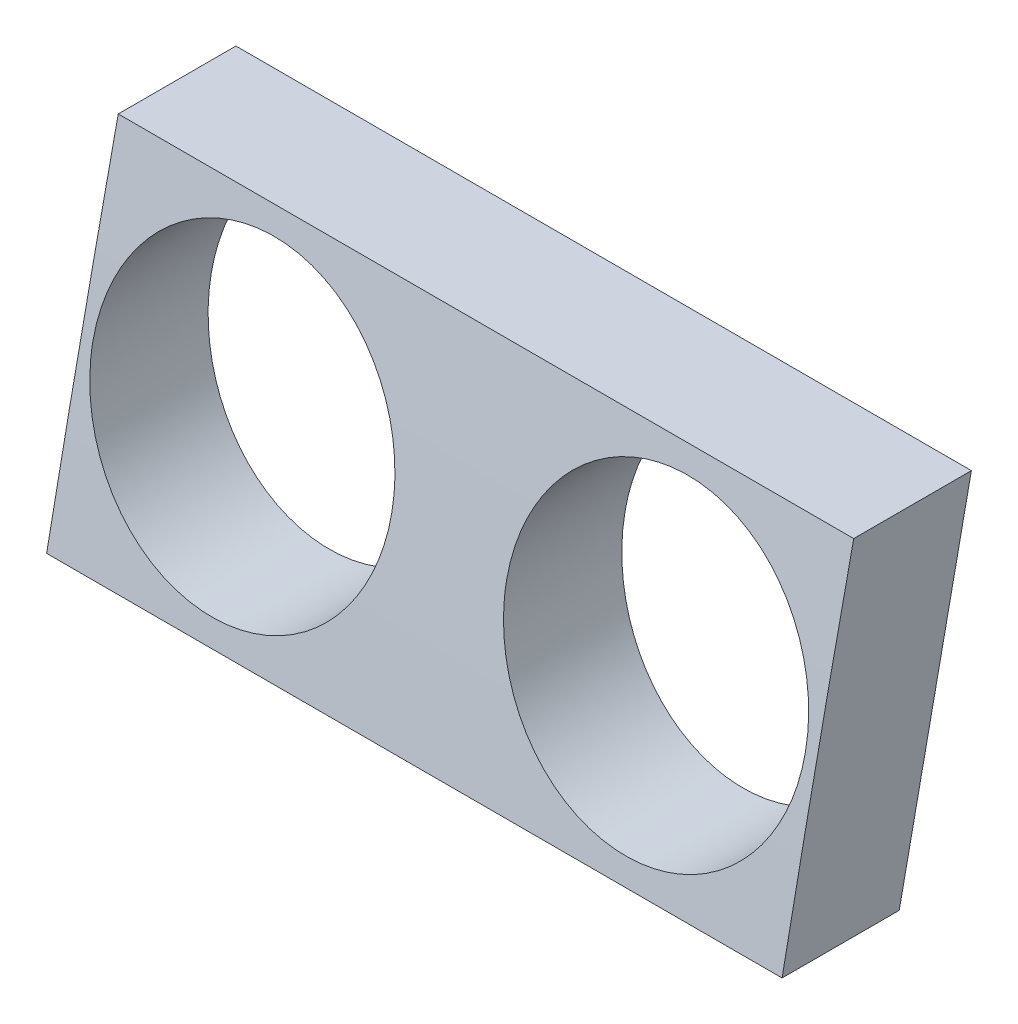
ISO-10303-21;
HEADER;
FILE_DESCRIPTION(('STEP AP214'),'2;1');
FILE_NAME('part.step','',(''),(''),'','','');
FILE_SCHEMA(('AUTOMOTIVE_DESIGN { 1 0 10303 214 1 1 1 1 }'));
ENDSEC;
DATA;
#1=APPLICATION_CONTEXT('core data for automotive mechanical design processes');
#2=APPLICATION_PROTOCOL_DEFINITION('international standard','automotive_design',2000,#1);
#3=PRODUCT_CONTEXT('',#1,'mechanical');
#4=PRODUCT('Part','Part','',(#3));
#5=PRODUCT_RELATED_PRODUCT_CATEGORY('part','',(#4));
#6=PRODUCT_DEFINITION_FORMATION('','',#4);
#7=PRODUCT_DEFINITION_CONTEXT('part definition',#1,'design');
#8=PRODUCT_DEFINITION('design','',#6,#7);
#9=PRODUCT_DEFINITION_SHAPE('','',#8);
#10=(LENGTH_UNIT() NAMED_UNIT(*) SI_UNIT(.MILLI.,.METRE.));
#11=(NAMED_UNIT(*) PLANE_ANGLE_UNIT() SI_UNIT($,.RADIAN.));
#12=(NAMED_UNIT(*) SI_UNIT($,.STERADIAN.) SOLID_ANGLE_UNIT());
#13=UNCERTAINTY_MEASURE_WITH_UNIT(LENGTH_MEASURE(1.E-05),#10,'distance_accuracy_value','');
#14=(GEOMETRIC_REPRESENTATION_CONTEXT(3) GLOBAL_UNCERTAINTY_ASSIGNED_CONTEXT((#13)) GLOBAL_UNIT_ASSIGNED_CONTEXT((#10,
#11,#12)) REPRESENTATION_CONTEXT('',''));
#15=CARTESIAN_POINT('',(0.,0.,0.));
#16=DIRECTION('',(0.,0.,1.));
#17=DIRECTION('',(1.,0.,0.));
#18=AXIS2_PLACEMENT_3D('',#15,#16,#17);
#19=CARTESIAN_POINT('',(33.9968010538605,114.317885572569,314.079701034348));
#20=DIRECTION('',(-1.,0.,0.));
#21=DIRECTION('',(0.,0.,1.));
#22=AXIS2_PLACEMENT_3D('',#19,#20,#21);
#23=PLANE('',#22);
#24=DIRECTION('',(0.,-0.978788199156415,0.204874745130144));
#25=VECTOR('',#24,1.);
#26=CARTESIAN_POINT('',(33.9968010538604,114.317885572569,-155.968991698223));
#27=LINE('',#26,#25);
#28=CARTESIAN_POINT('',(33.9968010538605,129.317885572569,-159.108711996854));
#29=VERTEX_POINT('',#28);
#30=CARTESIAN_POINT('',(33.9968010538604,114.317885572569,-155.968991698223));
#31=VERTEX_POINT('',#30);
#32=EDGE_CURVE('E63',#29,#31,#27,.T.);
#33=ORIENTED_EDGE('',*,*,#32,.T.);
#34=DIRECTION('',(0.,0.,-1.));
#35=VECTOR('',#34,1.);
#36=CARTESIAN_POINT('',(33.9968010538605,114.317885572569,314.079701034348));
#37=LINE('',#36,#35);
#38=CARTESIAN_POINT('',(33.9968010538605,114.317885572569,-150.872165521663));
#39=VERTEX_POINT('',#38);
#40=EDGE_CURVE('E99',#39,#31,#37,.T.);
#41=ORIENTED_EDGE('',*,*,#40,.F.);
#42=CARTESIAN_POINT('',(33.9968010538605,-125.065602570126,265.270668144395));
#43=CARTESIAN_POINT('',(33.9968010538605,-117.251277635846,172.226012995106));
#44=CARTESIAN_POINT('',(33.9968010538605,-135.426052024472,-37.3394253929721));
#45=CARTESIAN_POINT('',(33.9968010538605,-137.257312231371,-147.875913112743));
#46=CARTESIAN_POINT('',(33.9968010538605,-78.0900873110055,-207.114106349002));
#47=CARTESIAN_POINT('',(33.9968010538604,14.7819871578677,-96.4895904072925));
#48=CARTESIAN_POINT('',(33.9968010538604,321.817885572584,-214.72933185561));
#49=B_SPLINE_CURVE_WITH_KNOTS('',3,(#42,#43,#44,#45,#46,#47,#48),.UNSPECIFIED.,.F.,.F.,(4,1,1,1,
4),(0.,0.361871867439847,0.526261734758969,0.755385014590914,1.),.UNSPECIFIED.);
#50=CARTESIAN_POINT('',(33.9968010538605,129.317885572569,-153.988660568636));
#51=VERTEX_POINT('',#50);
#52=EDGE_CURVE('E11',#39,#51,#49,.T.);
#53=ORIENTED_EDGE('',*,*,#52,.T.);
#54=DIRECTION('',(0.,0.,-1.));
#55=VECTOR('',#54,1.);
#56=CARTESIAN_POINT('',(33.9968010538605,129.317885572569,314.079701034348));
#57=LINE('',#56,#55);
#58=EDGE_CURVE('E70',#51,#29,#57,.T.);
#59=ORIENTED_EDGE('',*,*,#58,.T.);
#60=EDGE_LOOP('',(#33,#41,#53,#59));
#61=FACE_BOUND('',#60,.T.);
#62=ADVANCED_FACE('F43',(#61),#23,.T.);
#63=CARTESIAN_POINT('',(65.9968010538605,114.317885572569,314.079701034348));
#64=DIRECTION('',(0.,-1.,0.));
#65=DIRECTION('',(0.,0.,-1.));
#66=AXIS2_PLACEMENT_3D('',#63,#64,#65);
#67=PLANE('',#66);
#68=DIRECTION('',(1.,0.,0.));
#69=VECTOR('',#68,1.);
#70=CARTESIAN_POINT('',(33.9968010538604,114.317885572569,-155.968991698223));
#71=LINE('',#70,#69);
#72=CARTESIAN_POINT('',(65.9968010538605,114.317885572569,-155.968991698223));
#73=VERTEX_POINT('',#72);
#74=EDGE_CURVE('E86',#31,#73,#71,.T.);
#75=ORIENTED_EDGE('',*,*,#74,.T.);
#76=DIRECTION('',(0.,0.,-1.));
#77=VECTOR('',#76,1.);
#78=CARTESIAN_POINT('',(65.9968010538605,114.317885572569,314.079701034348));
#79=LINE('',#78,#77);
#80=CARTESIAN_POINT('',(65.9968010538605,114.317885572569,-150.872165520551));
#81=VERTEX_POINT('',#80);
#82=EDGE_CURVE('E107',#81,#73,#79,.T.);
#83=ORIENTED_EDGE('',*,*,#82,.F.);
#84=DIRECTION('',(1.,0.,0.));
#85=VECTOR('',#84,1.);
#86=CARTESIAN_POINT('',(-0.00319894613948901,114.317885572569,-150.872165521663));
#87=LINE('',#86,#85);
#88=EDGE_CURVE('E55',#81,#39,#87,.F.);
#89=ORIENTED_EDGE('',*,*,#88,.T.);
#90=ORIENTED_EDGE('',*,*,#40,.T.);
#91=EDGE_LOOP('',(#75,#83,#89,#90));
#92=FACE_BOUND('',#91,.T.);
#93=ADVANCED_FACE('F103',(#92),#67,.T.);
#94=CARTESIAN_POINT('',(65.9968010538605,114.317885572569,314.079701034348));
#95=DIRECTION('',(1.,0.,0.));
#96=DIRECTION('',(0.,0.,-1.));
#97=AXIS2_PLACEMENT_3D('',#94,#95,#96);
#98=PLANE('',#97);
#99=DIRECTION('',(0.,-0.978788199156415,0.204874745130144));
#100=VECTOR('',#99,1.);
#101=CARTESIAN_POINT('',(65.9968010538605,114.317885572569,-155.968991698223));
#102=LINE('',#101,#100);
#103=CARTESIAN_POINT('',(65.9968010538605,129.317885572569,-159.108711996854));
#104=VERTEX_POINT('',#103);
#105=EDGE_CURVE('E89',#104,#73,#102,.T.);
#106=ORIENTED_EDGE('',*,*,#105,.F.);
#107=DIRECTION('',(0.,0.,-1.));
#108=VECTOR('',#107,1.);
#109=CARTESIAN_POINT('',(65.9968010538605,129.317885572569,314.079701034348));
#110=LINE('',#109,#108);
#111=CARTESIAN_POINT('',(65.9968010538605,129.317885572569,-153.988660568636));
#112=VERTEX_POINT('',#111);
#113=EDGE_CURVE('E113',#112,#104,#110,.T.);
#114=ORIENTED_EDGE('',*,*,#113,.F.);
#115=CARTESIAN_POINT('',(65.9968010538605,-125.065602570126,265.270668144395));
#116=CARTESIAN_POINT('',(65.9968010538605,-117.251277635846,172.226012995106));
#117=CARTESIAN_POINT('',(65.9968010538605,-135.426052024472,-37.3394253929721));
#118=CARTESIAN_POINT('',(65.9968010538605,-137.257312231371,-147.875913112743));
#119=CARTESIAN_POINT('',(65.9968010538605,-78.0900873110055,-207.114106349002));
#120=CARTESIAN_POINT('',(65.9968010538605,14.7819871578677,-96.4895904072925));
#121=CARTESIAN_POINT('',(65.9968010538605,321.817885572584,-214.72933185561));
#122=B_SPLINE_CURVE_WITH_KNOTS('',3,(#115,#116,#117,#118,#119,#120,#121),.UNSPECIFIED.,.F.,.F.,
(4,1,1,1,4),(0.,0.361871867439847,0.526261734758969,0.755385014590914,1.),.UNSPECIFIED.);
#123=EDGE_CURVE('E111',#112,#81,#122,.F.);
#124=ORIENTED_EDGE('',*,*,#123,.T.);
#125=ORIENTED_EDGE('',*,*,#82,.T.);
#126=EDGE_LOOP('',(#106,#114,#124,#125));
#127=FACE_BOUND('',#126,.T.);
#128=ADVANCED_FACE('F176',(#127),#98,.T.);
#129=CARTESIAN_POINT('',(65.9968010538605,129.317885572569,314.079701034348));
#130=DIRECTION('',(0.,1.,0.));
#131=DIRECTION('',(0.,0.,1.));
#132=AXIS2_PLACEMENT_3D('',#129,#130,#131);
#133=PLANE('',#132);
#134=DIRECTION('',(1.,0.,0.));
#135=VECTOR('',#134,1.);
#136=CARTESIAN_POINT('',(33.9968010538604,129.317885572569,-159.108711996854));
#137=LINE('',#136,#135);
#138=EDGE_CURVE('E95',#29,#104,#137,.T.);
#139=ORIENTED_EDGE('',*,*,#138,.F.);
#140=ORIENTED_EDGE('',*,*,#58,.F.);
#141=DIRECTION('',(1.,0.,0.));
#142=VECTOR('',#141,1.);
#143=CARTESIAN_POINT('',(-0.00319894613949071,129.317885572569,-153.988660568636));
#144=LINE('',#143,#142);
#145=EDGE_CURVE('E106',#51,#112,#144,.T.);
#146=ORIENTED_EDGE('',*,*,#145,.T.);
#147=ORIENTED_EDGE('',*,*,#113,.T.);
#148=EDGE_LOOP('',(#139,#140,#146,#147));
#149=FACE_BOUND('',#148,.T.);
#150=ADVANCED_FACE('F179',(#149),#133,.T.);
#151=CARTESIAN_POINT('',(-200.003198946139,-125.065602570126,265.270668144395));
#152=CARTESIAN_POINT('',(-200.003198946139,-117.251277635846,172.226012995106));
#153=CARTESIAN_POINT('',(-200.003198946139,-135.426052024472,-37.3394253929721));
#154=CARTESIAN_POINT('',(-200.003198946139,-137.257312231371,-147.875913112743));
#155=CARTESIAN_POINT('',(-200.003198946139,-78.0900873110055,-207.114106349002));
#156=CARTESIAN_POINT('',(-200.00319894614,14.7819871578677,-96.4895904072925));
#157=CARTESIAN_POINT('',(-200.00319894614,321.817885572583,-214.72933185561));
#158=B_SPLINE_CURVE_WITH_KNOTS('',3,(#151,#152,#153,#154,#155,#156,#157),.UNSPECIFIED.,.F.,.F.,
(4,1,1,1,4),(0.,0.361871867439847,0.526261734758969,0.755385014590914,1.),.UNSPECIFIED.);
#159=DIRECTION('',(1.,0.,0.));
#160=VECTOR('',#159,1.);
#161=SURFACE_OF_LINEAR_EXTRUSION('',#158,#160);
#162=CARTESIAN_POINT('',(52.4968010538605,121.817885572569,-152.387851020532));
#163=CARTESIAN_POINT('',(52.4967999051049,122.003673449547,-152.426471125802));
#164=CARTESIAN_POINT('',(52.5047692796665,122.189424935316,-152.465162219448));
#165=CARTESIAN_POINT('',(52.5365914936259,122.559649588583,-152.542432745769));
#166=CARTESIAN_POINT('',(52.5604485726214,122.74412240159,-152.581012145879));
#167=CARTESIAN_POINT('',(52.6239271615071,123.110594381692,-152.657803938396));
#168=CARTESIAN_POINT('',(52.6635632686161,123.29259109646,-152.696015957321));
#169=CARTESIAN_POINT('',(52.7583644222967,123.65271209437,-152.771770987836));
#170=CARTESIAN_POINT('',(52.8135351059352,123.830834946471,-152.809313751304));
#171=CARTESIAN_POINT('',(52.939021259906,124.181784282804,-152.883418752228));
#172=CARTESIAN_POINT('',(53.0093301406705,124.354613034255,-152.919981408556));
#173=CARTESIAN_POINT('',(53.164685523062,124.693863192213,-152.991877029457));
#174=CARTESIAN_POINT('',(53.2497374661033,124.86028220518,-153.0272095342));
#175=CARTESIAN_POINT('',(53.4339497051151,125.185311413611,-153.096331229337));
#176=CARTESIAN_POINT('',(53.5331008743431,125.343926571973,-153.130121399571));
#177=CARTESIAN_POINT('',(53.7449385719755,125.652328039188,-153.195923119203));
#178=CARTESIAN_POINT('',(53.8576300171762,125.802111111289,-153.227934016295));
#179=CARTESIAN_POINT('',(54.094653786049,126.09028947536,-153.289610916369));
#180=CARTESIAN_POINT('',(54.2188682504744,126.228777626495,-153.319295939439));
#181=CARTESIAN_POINT('',(54.4789708822384,126.494831034383,-153.376399308368));
#182=CARTESIAN_POINT('',(54.6148589881385,126.622396348618,-153.403817666154));
#183=CARTESIAN_POINT('',(54.897363433526,126.865592750931,-153.45615097803));
#184=CARTESIAN_POINT('',(55.0439792489731,126.981224421294,-153.481066054261));
#185=CARTESIAN_POINT('',(55.3469108931194,127.199629500555,-153.528174761057));
#186=CARTESIAN_POINT('',(55.5032267829302,127.302402828432,-153.550368374472));
#187=CARTESIAN_POINT('',(55.8210143175074,127.492205149208,-153.591392567697));
#188=CARTESIAN_POINT('',(55.9823062074768,127.579521922996,-153.61028450984));
#189=CARTESIAN_POINT('',(56.3120125649677,127.740348223233,-153.645106796645));
#190=CARTESIAN_POINT('',(56.4804294675904,127.813852981703,-153.661036118577));
#191=CARTESIAN_POINT('',(56.8230345217487,127.946381221148,-153.689773532487));
#192=CARTESIAN_POINT('',(56.9972199115034,128.005411521472,-153.702583094257));
#193=CARTESIAN_POINT('',(57.350224988919,128.108562123355,-153.724976635224));
#194=CARTESIAN_POINT('',(57.5290463390387,128.152676994322,-153.734559439577));
#195=CARTESIAN_POINT('',(57.8861968481142,128.224839701975,-153.750239421178));
#196=CARTESIAN_POINT('',(58.0644598057095,128.253200741991,-153.75640454033));
#197=CARTESIAN_POINT('',(58.4228104596834,128.295004890137,-153.765493140324));
#198=CARTESIAN_POINT('',(58.6028981611979,128.308447956266,-153.76841661204));
#199=CARTESIAN_POINT('',(58.963575260386,128.320304412812,-153.770995002166));
#200=CARTESIAN_POINT('',(59.1441646136922,128.318719092566,-153.770650200973));
#201=CARTESIAN_POINT('',(59.504553991864,128.300534727659,-153.766695823091));
#202=CARTESIAN_POINT('',(59.6843540002552,128.283935371125,-153.763086178584));
#203=CARTESIAN_POINT('',(60.0400804681212,128.23609836584,-153.752686961712));
#204=CARTESIAN_POINT('',(60.2160276642156,128.205007783545,-153.745929337479));
#205=CARTESIAN_POINT('',(60.5646865734865,128.128479927136,-153.729303342942));
#206=CARTESIAN_POINT('',(60.7373971605226,128.083037754249,-153.719433910455));
#207=CARTESIAN_POINT('',(61.0782534435946,127.978188927657,-153.696675687456));
#208=CARTESIAN_POINT('',(61.2464007480232,127.91878726739,-153.683787976615));
#209=CARTESIAN_POINT('',(61.5770951540629,127.786454700602,-153.655098255186));
#210=CARTESIAN_POINT('',(61.739640148945,127.713518768986,-153.639295162168));
#211=CARTESIAN_POINT('',(62.0588051352741,127.554268383453,-153.60482005702));
#212=CARTESIAN_POINT('',(62.2153897333147,127.467886021787,-153.586133487043));
#213=CARTESIAN_POINT('',(62.5206942366196,127.282692291112,-153.546111577946));
#214=CARTESIAN_POINT('',(62.6694112374765,127.183876376981,-153.524775270243));
#215=CARTESIAN_POINT('',(63.1021459521383,126.869900793694,-153.457057734582));
#216=CARTESIAN_POINT('',(63.3730609283547,126.637056171298,-153.406933823186));
#217=CARTESIAN_POINT('',(63.8767580669649,126.126830661157,-153.297406966526));
#218=CARTESIAN_POINT('',(64.1087692865056,125.848725998593,-153.237853742498));
#219=CARTESIAN_POINT('',(64.5230054232472,125.258944749711,-153.111967525121));
#220=CARTESIAN_POINT('',(64.7052247234899,124.947264381288,-153.04563376803));
#221=CARTESIAN_POINT('',(65.0187604720515,124.291914135414,-152.90665274245));
#222=CARTESIAN_POINT('',(65.1488836922041,123.947695964896,-152.833899541511));
#223=CARTESIAN_POINT('',(65.3492628563535,123.242842167208,-152.685497481452));
#224=CARTESIAN_POINT('',(65.4195129894471,122.882204950088,-152.609848342014));
#225=CARTESIAN_POINT('',(65.4990170969021,122.148653792538,-152.456588397014));
#226=CARTESIAN_POINT('',(65.5072921810556,121.775635943112,-152.378965466097));
#227=CARTESIAN_POINT('',(65.4599928277138,121.033363175079,-152.225132393776));
#228=CARTESIAN_POINT('',(65.404415925404,120.66410840229,-152.148922307027));
#229=CARTESIAN_POINT('',(65.2304389847472,119.938722151862,-151.999807452407));
#230=CARTESIAN_POINT('',(65.1118463843297,119.582634496839,-151.926913563354));
#231=CARTESIAN_POINT('',(64.8147438431926,118.895250014476,-151.786732821583));
#232=CARTESIAN_POINT('',(64.6362362858795,118.563952201641,-151.71944574596));
#233=CARTESIAN_POINT('',(64.2259416021186,117.939212151061,-151.592996883485));
#234=CARTESIAN_POINT('',(63.9947245309101,117.64541387533,-151.533758268182));
#235=CARTESIAN_POINT('',(63.6122800801544,117.237245633697,-151.451701579717));
#236=CARTESIAN_POINT('',(63.4787974862787,117.106562220547,-151.425473141062));
#237=CARTESIAN_POINT('',(63.200864097145,116.856961472092,-151.375447703788));
#238=CARTESIAN_POINT('',(63.0564137286987,116.738043679342,-151.351650610638));
#239=CARTESIAN_POINT('',(62.6135259677715,116.404594453302,-151.285006551329));
#240=CARTESIAN_POINT('',(62.3005268213514,116.20801948273,-151.245833404403));
#241=CARTESIAN_POINT('',(61.8093051829085,115.954951086987,-151.195488493267));
#242=CARTESIAN_POINT('',(61.6418535508331,115.877531938512,-151.180103650323));
#243=CARTESIAN_POINT('',(61.3007743711352,115.737126797321,-151.152223223532));
#244=CARTESIAN_POINT('',(61.1271492888399,115.674135116238,-151.139726500959));
#245=CARTESIAN_POINT('',(60.7782016559149,115.564126956078,-151.117914930208));
#246=CARTESIAN_POINT('',(60.6029667196593,115.516841947308,-151.108546581118));
#247=CARTESIAN_POINT('',(60.2490898511633,115.437082404338,-151.092750397077));
#248=CARTESIAN_POINT('',(60.0704492010533,115.404602406964,-151.086321477449));
#249=CARTESIAN_POINT('',(59.7109739582594,115.354690341937,-151.076444225016));
#250=CARTESIAN_POINT('',(59.5301390857745,115.337260214293,-151.072996276473));
#251=CARTESIAN_POINT('',(59.1676167337733,115.317595418055,-151.069106380324));
#252=CARTESIAN_POINT('',(58.9859292779943,115.315360328889,-151.068664349519));
#253=CARTESIAN_POINT('',(58.6250035378079,115.326044032542,-151.070777582262));
#254=CARTESIAN_POINT('',(58.4457601531701,115.338797819226,-151.073300209154));
#255=CARTESIAN_POINT('',(58.0890108764384,115.37908604178,-151.081271644066));
#256=CARTESIAN_POINT('',(57.911504955467,115.406620231566,-151.086720403369));
#257=CARTESIAN_POINT('',(57.5594579244126,115.476257464352,-151.100507962368));
#258=CARTESIAN_POINT('',(57.3849173219339,115.518362975832,-151.108847251741));
#259=CARTESIAN_POINT('',(57.040123844986,115.616793271799,-151.128355286839));
#260=CARTESIAN_POINT('',(56.8698694525541,115.673112942159,-151.139523014924));
#261=CARTESIAN_POINT('',(56.534610769283,115.79960100728,-151.16462568671));
#262=CARTESIAN_POINT('',(56.3696116328765,115.869782539997,-151.178563255681));
#263=CARTESIAN_POINT('',(56.0462295620499,116.02339165202,-151.20909945881));
#264=CARTESIAN_POINT('',(55.8878442940141,116.106814508559,-151.225697144207));
#265=CARTESIAN_POINT('',(55.5786501774763,116.286320561844,-151.261452327928));
#266=CARTESIAN_POINT('',(55.42784393868,116.382408078741,-151.280610699782));
#267=CARTESIAN_POINT('',(55.1349246966177,116.586465021118,-151.321348713367));
#268=CARTESIAN_POINT('',(54.9928087094179,116.694430332123,-151.342927516709));
#269=CARTESIAN_POINT('',(54.7165070690814,116.922827724446,-151.388641087644));
#270=CARTESIAN_POINT('',(54.5824360028384,117.043392950851,-151.412803231841));
#271=CARTESIAN_POINT('',(54.3250163261946,117.294965532562,-151.463297874771));
#272=CARTESIAN_POINT('',(54.2016640628077,117.425969300987,-151.489629628091));
#273=CARTESIAN_POINT('',(53.966345134801,117.697591556655,-151.544315352813));
#274=CARTESIAN_POINT('',(53.8543860144019,117.838216312919,-151.572670643277));
#275=CARTESIAN_POINT('',(53.6426872910931,118.127947077779,-151.631192541317));
#276=CARTESIAN_POINT('',(53.5429435499449,118.277050188932,-151.661358530288));
#277=CARTESIAN_POINT('',(53.3544453752247,118.585681398498,-151.723912414706));
#278=CARTESIAN_POINT('',(53.265939504799,118.745354944112,-151.756331907594));
#279=CARTESIAN_POINT('',(53.1027945856014,119.071271626243,-151.82263075912));
#280=CARTESIAN_POINT('',(53.0281508955102,119.237512541191,-151.856509624435));
#281=CARTESIAN_POINT('',(52.8932016309381,119.575314474734,-151.92548589504));
#282=CARTESIAN_POINT('',(52.832884739436,119.746871172367,-151.960582313275));
#283=CARTESIAN_POINT('',(52.7268872315548,120.094184156171,-152.031775100643));
#284=CARTESIAN_POINT('',(52.6812030510027,120.26993940845,-152.067871223943));
#285=CARTESIAN_POINT('',(52.5943893089045,120.672392465278,-152.150691412589));
#286=CARTESIAN_POINT('',(52.5578160560971,120.90003793882,-152.197654771695));
#287=CARTESIAN_POINT('',(52.509022509041,121.357769377254,-152.292326147593));
#288=CARTESIAN_POINT('',(52.4968024761733,121.587855368313,-152.34003417237));
#289=CARTESIAN_POINT('',(52.4968010538605,121.817885572569,-152.387851020532));
#290=B_SPLINE_CURVE_WITH_KNOTS('',3,(#162,#163,#164,#165,#166,#167,#168,#169,#170,#171,#172,
#173,#174,#175,#176,#177,#178,#179,#180,#181,#182,#183,#184,#185,#186,#187,#188,#189,#190,#191,
#192,#193,#194,#195,#196,#197,#198,#199,#200,#201,#202,#203,#204,#205,#206,#207,#208,#209,#210,
#211,#212,#213,#214,#215,#216,#217,#218,#219,#220,#221,#222,#223,#224,#225,#226,#227,#228,#229,
#230,#231,#232,#233,#234,#235,#236,#237,#238,#239,#240,#241,#242,#243,#244,#245,#246,#247,#248,
#249,#250,#251,#252,#253,#254,#255,#256,#257,#258,#259,#260,#261,#262,#263,#264,#265,#266,#267,
#268,#269,#270,#271,#272,#273,#274,#275,#276,#277,#278,#279,#280,#281,#282,#283,#284,#285,#286,
#287,#288,#289),.UNSPECIFIED.,.T.,.F.,(4,2,2,2,2,2,2,2,2,2,2,2,2,2,2,2,2,2,2,2,2,2,2,2,2,2,2,2,
2,2,2,2,2,2,2,2,2,2,2,2,2,2,2,2,2,2,2,2,2,2,2,2,2,2,2,2,2,2,2,2,2,2,2,4),(0.,0.569074781778865,
1.13830148074252,1.70805600104299,2.27801753649183,2.84773147083728,3.4176561264015,
3.98721352243881,4.55697836693515,5.12145052115293,5.68591970472594,6.25036133279942,
6.81480651727025,7.36727597297288,7.91993579501277,8.47233474009721,9.02493459333079,
9.56611431187093,10.1072955540539,10.6484303668239,11.1895764203484,11.7253463108784,
12.2612992791573,12.7970608231159,13.33302168765,13.8717827848509,14.4107414031414,
15.4876144896571,16.5837987559694,17.680106630322,18.8002571513961,19.9205163748223,
21.0584334035349,22.1963943595958,23.3378528416336,24.4792659220324,25.6088756040769,
26.17416356903,26.7394295470258,27.8479930464156,28.4028388387243,28.957465492114,
29.5020527858426,30.0464389592005,30.5908952963531,31.1353365638332,31.6738400200339,
32.21233451086,32.7509202710188,33.2893125283775,33.8282175316063,34.3669307543889,
34.9058282202349,35.4445395959726,35.9896659640359,36.5346058174633,37.0799041983573,
37.6250173329511,38.1806260157795,38.7360483336278,39.2910304423771,39.8458772679819,
40.5504602873697,41.2550508689471),.UNSPECIFIED.);
#291=CARTESIAN_POINT('',(52.4968010538605,121.817885572569,-152.387851020532));
#292=VERTEX_POINT('',#291);
#293=EDGE_CURVE('E154',#292,#292,#290,.T.);
#294=ORIENTED_EDGE('',*,*,#293,.T.);
#295=EDGE_LOOP('',(#294));
#296=FACE_BOUND('',#295,.T.);
#297=CARTESIAN_POINT('',(34.4968010538605,121.817885572569,-152.387851020532));
#298=CARTESIAN_POINT('',(34.4967999051049,122.003673449547,-152.426471125802));
#299=CARTESIAN_POINT('',(34.5047692796665,122.189424935316,-152.465162219448));
#300=CARTESIAN_POINT('',(34.5365914936259,122.559649588583,-152.542432745769));
#301=CARTESIAN_POINT('',(34.5604485726214,122.74412240159,-152.581012145879));
#302=CARTESIAN_POINT('',(34.6239271615071,123.110594381692,-152.657803938396));
#303=CARTESIAN_POINT('',(34.6635632686161,123.29259109646,-152.696015957321));
#304=CARTESIAN_POINT('',(34.7583644222967,123.65271209437,-152.771770987836));
#305=CARTESIAN_POINT('',(34.8135351059352,123.830834946471,-152.809313751304));
#306=CARTESIAN_POINT('',(34.939021259906,124.181784282804,-152.883418752228));
#307=CARTESIAN_POINT('',(35.0093301406705,124.354613034255,-152.919981408556));
#308=CARTESIAN_POINT('',(35.164685523062,124.693863192213,-152.991877029457));
#309=CARTESIAN_POINT('',(35.2497374661033,124.86028220518,-153.0272095342));
#310=CARTESIAN_POINT('',(35.4339497051151,125.185311413611,-153.096331229337));
#311=CARTESIAN_POINT('',(35.5331008743431,125.343926571973,-153.130121399571));
#312=CARTESIAN_POINT('',(35.7449385719755,125.652328039188,-153.195923119203));
#313=CARTESIAN_POINT('',(35.8576300171762,125.802111111289,-153.227934016295));
#314=CARTESIAN_POINT('',(36.094653786049,126.09028947536,-153.289610916369));
#315=CARTESIAN_POINT('',(36.2188682504744,126.228777626495,-153.319295939439));
#316=CARTESIAN_POINT('',(36.4789708822384,126.494831034383,-153.376399308368));
#317=CARTESIAN_POINT('',(36.6148589881385,126.622396348618,-153.403817666154));
#318=CARTESIAN_POINT('',(36.897363433526,126.865592750931,-153.45615097803));
#319=CARTESIAN_POINT('',(37.0439792489731,126.981224421294,-153.481066054261));
#320=CARTESIAN_POINT('',(37.3469108931194,127.199629500555,-153.528174761057));
#321=CARTESIAN_POINT('',(37.5032267829301,127.302402828432,-153.550368374472));
#322=CARTESIAN_POINT('',(37.8210143175074,127.492205149208,-153.591392567697));
#323=CARTESIAN_POINT('',(37.9823062074767,127.579521922996,-153.61028450984));
#324=CARTESIAN_POINT('',(38.3120125649677,127.740348223233,-153.645106796645));
#325=CARTESIAN_POINT('',(38.4804294675904,127.813852981703,-153.661036118577));
#326=CARTESIAN_POINT('',(38.8230345217487,127.946381221148,-153.689773532487));
#327=CARTESIAN_POINT('',(38.9972199115034,128.005411521472,-153.702583094257));
#328=CARTESIAN_POINT('',(39.350224988919,128.108562123355,-153.724976635224));
#329=CARTESIAN_POINT('',(39.5290463390387,128.152676994322,-153.734559439577));
#330=CARTESIAN_POINT('',(39.8861968481142,128.224839701975,-153.750239421178));
#331=CARTESIAN_POINT('',(40.0644598057096,128.253200741991,-153.75640454033));
#332=CARTESIAN_POINT('',(40.4228104596834,128.295004890137,-153.765493140324));
#333=CARTESIAN_POINT('',(40.6028981611979,128.308447956266,-153.76841661204));
#334=CARTESIAN_POINT('',(40.963575260386,128.320304412812,-153.770995002166));
#335=CARTESIAN_POINT('',(41.1441646136923,128.318719092566,-153.770650200973));
#336=CARTESIAN_POINT('',(41.504553991864,128.300534727659,-153.766695823091));
#337=CARTESIAN_POINT('',(41.6843540002552,128.283935371125,-153.763086178584));
#338=CARTESIAN_POINT('',(42.0400804681212,128.23609836584,-153.752686961712));
#339=CARTESIAN_POINT('',(42.2160276642156,128.205007783545,-153.745929337479));
#340=CARTESIAN_POINT('',(42.5646865734865,128.128479927136,-153.729303342942));
#341=CARTESIAN_POINT('',(42.7373971605226,128.083037754249,-153.719433910455));
#342=CARTESIAN_POINT('',(43.0782534435946,127.978188927657,-153.696675687456));
#343=CARTESIAN_POINT('',(43.2464007480232,127.91878726739,-153.683787976615));
#344=CARTESIAN_POINT('',(43.5770951540629,127.786454700602,-153.655098255186));
#345=CARTESIAN_POINT('',(43.739640148945,127.713518768986,-153.639295162168));
#346=CARTESIAN_POINT('',(44.0588051352741,127.554268383453,-153.60482005702));
#347=CARTESIAN_POINT('',(44.2153897333147,127.467886021787,-153.586133487043));
#348=CARTESIAN_POINT('',(44.5206942366196,127.282692291113,-153.546111577946));
#349=CARTESIAN_POINT('',(44.6694112374765,127.183876376981,-153.524775270243));
#350=CARTESIAN_POINT('',(45.1021459521383,126.869900793694,-153.457057734582));
#351=CARTESIAN_POINT('',(45.3730609283546,126.637056171298,-153.406933823186));
#352=CARTESIAN_POINT('',(45.8767580669648,126.126830661157,-153.297406966526));
#353=CARTESIAN_POINT('',(46.1087692865055,125.848725998594,-153.237853742498));
#354=CARTESIAN_POINT('',(46.5230054232471,125.258944749711,-153.111967525121));
#355=CARTESIAN_POINT('',(46.7052247234899,124.947264381288,-153.04563376803));
#356=CARTESIAN_POINT('',(47.0187604720515,124.291914135414,-152.90665274245));
#357=CARTESIAN_POINT('',(47.1488836922041,123.947695964896,-152.833899541511));
#358=CARTESIAN_POINT('',(47.3492628563535,123.242842167208,-152.685497481452));
#359=CARTESIAN_POINT('',(47.4195129894471,122.882204950088,-152.609848342014));
#360=CARTESIAN_POINT('',(47.4990170969021,122.148653792538,-152.456588397014));
#361=CARTESIAN_POINT('',(47.5072921810556,121.775635943112,-152.378965466097));
#362=CARTESIAN_POINT('',(47.4599928277138,121.033363175079,-152.225132393776));
#363=CARTESIAN_POINT('',(47.404415925404,120.66410840229,-152.148922307027));
#364=CARTESIAN_POINT('',(47.2304389847472,119.938722151862,-151.999807452407));
#365=CARTESIAN_POINT('',(47.1118463843297,119.582634496839,-151.926913563354));
#366=CARTESIAN_POINT('',(46.8147438431926,118.895250014476,-151.786732821583));
#367=CARTESIAN_POINT('',(46.6362362858795,118.563952201641,-151.71944574596));
#368=CARTESIAN_POINT('',(46.2259416021186,117.939212151061,-151.592996883485));
#369=CARTESIAN_POINT('',(45.9947245309101,117.64541387533,-151.533758268182));
#370=CARTESIAN_POINT('',(45.6122800801544,117.237245633697,-151.451701579717));
#371=CARTESIAN_POINT('',(45.4787974862787,117.106562220547,-151.425473141062));
#372=CARTESIAN_POINT('',(45.200864097145,116.856961472092,-151.375447703788));
#373=CARTESIAN_POINT('',(45.0564137286987,116.738043679342,-151.351650610638));
#374=CARTESIAN_POINT('',(44.6135259677715,116.404594453301,-151.285006551329));
#375=CARTESIAN_POINT('',(44.3005268213514,116.20801948273,-151.245833404403));
#376=CARTESIAN_POINT('',(43.8093051829085,115.954951086987,-151.195488493268));
#377=CARTESIAN_POINT('',(43.6418535508331,115.877531938512,-151.180103650323));
#378=CARTESIAN_POINT('',(43.3007743711352,115.737126797321,-151.152223223532));
#379=CARTESIAN_POINT('',(43.1271492888399,115.674135116238,-151.139726500959));
#380=CARTESIAN_POINT('',(42.7782016559149,115.564126956078,-151.117914930208));
#381=CARTESIAN_POINT('',(42.6029667196593,115.516841947308,-151.108546581118));
#382=CARTESIAN_POINT('',(42.2490898511633,115.437082404338,-151.092750397077));
#383=CARTESIAN_POINT('',(42.0704492010533,115.404602406964,-151.086321477449));
#384=CARTESIAN_POINT('',(41.7109739582595,115.354690341937,-151.076444225016));
#385=CARTESIAN_POINT('',(41.5301390857746,115.337260214293,-151.072996276473));
#386=CARTESIAN_POINT('',(41.1676167337734,115.317595418055,-151.069106380324));
#387=CARTESIAN_POINT('',(40.9859292779944,115.315360328889,-151.068664349519));
#388=CARTESIAN_POINT('',(40.6250035378079,115.326044032542,-151.070777582262));
#389=CARTESIAN_POINT('',(40.4457601531702,115.338797819226,-151.073300209154));
#390=CARTESIAN_POINT('',(40.0890108764384,115.37908604178,-151.081271644066));
#391=CARTESIAN_POINT('',(39.9115049554671,115.406620231566,-151.086720403369));
#392=CARTESIAN_POINT('',(39.5594579244126,115.476257464352,-151.100507962368));
#393=CARTESIAN_POINT('',(39.3849173219339,115.518362975832,-151.108847251741));
#394=CARTESIAN_POINT('',(39.040123844986,115.616793271799,-151.128355286839));
#395=CARTESIAN_POINT('',(38.8698694525542,115.673112942159,-151.139523014924));
#396=CARTESIAN_POINT('',(38.534610769283,115.79960100728,-151.16462568671));
#397=CARTESIAN_POINT('',(38.3696116328765,115.869782539997,-151.178563255681));
#398=CARTESIAN_POINT('',(38.0462295620499,116.02339165202,-151.20909945881));
#399=CARTESIAN_POINT('',(37.8878442940141,116.106814508559,-151.225697144207));
#400=CARTESIAN_POINT('',(37.5786501774764,116.286320561844,-151.261452327928));
#401=CARTESIAN_POINT('',(37.4278439386801,116.382408078741,-151.280610699782));
#402=CARTESIAN_POINT('',(37.1349246966177,116.586465021118,-151.321348713367));
#403=CARTESIAN_POINT('',(36.9928087094179,116.694430332123,-151.342927516709));
#404=CARTESIAN_POINT('',(36.7165070690815,116.922827724446,-151.388641087644));
#405=CARTESIAN_POINT('',(36.5824360028384,117.043392950851,-151.412803231841));
#406=CARTESIAN_POINT('',(36.3250163261947,117.294965532562,-151.463297874771));
#407=CARTESIAN_POINT('',(36.2016640628078,117.425969300987,-151.489629628091));
#408=CARTESIAN_POINT('',(35.966345134801,117.697591556655,-151.544315352813));
#409=CARTESIAN_POINT('',(35.8543860144019,117.838216312919,-151.572670643277));
#410=CARTESIAN_POINT('',(35.6426872910931,118.127947077779,-151.631192541317));
#411=CARTESIAN_POINT('',(35.5429435499449,118.277050188932,-151.661358530288));
#412=CARTESIAN_POINT('',(35.3544453752247,118.585681398498,-151.723912414707));
#413=CARTESIAN_POINT('',(35.265939504799,118.745354944112,-151.756331907594));
#414=CARTESIAN_POINT('',(35.1027945856014,119.071271626243,-151.82263075912));
#415=CARTESIAN_POINT('',(35.0281508955102,119.237512541191,-151.856509624435));
#416=CARTESIAN_POINT('',(34.8932016309381,119.575314474734,-151.92548589504));
#417=CARTESIAN_POINT('',(34.832884739436,119.746871172367,-151.960582313275));
#418=CARTESIAN_POINT('',(34.7268872315548,120.094184156171,-152.031775100643));
#419=CARTESIAN_POINT('',(34.6812030510027,120.26993940845,-152.067871223943));
#420=CARTESIAN_POINT('',(34.5943893089045,120.672392465278,-152.150691412589));
#421=CARTESIAN_POINT('',(34.5578160560971,120.90003793882,-152.197654771695));
#422=CARTESIAN_POINT('',(34.509022509041,121.357769377254,-152.292326147593));
#423=CARTESIAN_POINT('',(34.4968024761733,121.587855368313,-152.34003417237));
#424=CARTESIAN_POINT('',(34.4968010538605,121.817885572569,-152.387851020532));
#425=B_SPLINE_CURVE_WITH_KNOTS('',3,(#297,#298,#299,#300,#301,#302,#303,#304,#305,#306,#307,
#308,#309,#310,#311,#312,#313,#314,#315,#316,#317,#318,#319,#320,#321,#322,#323,#324,#325,#326,
#327,#328,#329,#330,#331,#332,#333,#334,#335,#336,#337,#338,#339,#340,#341,#342,#343,#344,#345,
#346,#347,#348,#349,#350,#351,#352,#353,#354,#355,#356,#357,#358,#359,#360,#361,#362,#363,#364,
#365,#366,#367,#368,#369,#370,#371,#372,#373,#374,#375,#376,#377,#378,#379,#380,#381,#382,#383,
#384,#385,#386,#387,#388,#389,#390,#391,#392,#393,#394,#395,#396,#397,#398,#399,#400,#401,#402,
#403,#404,#405,#406,#407,#408,#409,#410,#411,#412,#413,#414,#415,#416,#417,#418,#419,#420,#421,
#422,#423,#424),.UNSPECIFIED.,.T.,.F.,(4,2,2,2,2,2,2,2,2,2,2,2,2,2,2,2,2,2,2,2,2,2,2,2,2,2,2,2,
2,2,2,2,2,2,2,2,2,2,2,2,2,2,2,2,2,2,2,2,2,2,2,2,2,2,2,2,2,2,2,2,2,2,2,4),(0.,0.569074781778865,
1.13830148074252,1.70805600104299,2.27801753649182,2.84773147083729,3.41765612640151,
3.98721352243882,4.55697836693518,5.12145052115297,5.68591970472596,6.25036133279942,
6.81480651727026,7.36727597297289,7.91993579501279,8.47233474009724,9.02493459333082,
9.56611431187097,10.1072955540539,10.6484303668239,11.1895764203484,11.7253463108784,
12.2612992791573,12.7970608231159,13.3330216876501,13.8717827848509,14.4107414031414,
15.4876144896571,16.5837987559693,17.6801066303218,18.800257151396,19.9205163748223,
21.0584334035349,22.1963943595959,23.3378528416336,24.4792659220324,25.608875604077,
26.1741635690301,26.7394295470258,27.8479930464156,28.4028388387243,28.957465492114,
29.5020527858426,30.0464389592005,30.5908952963531,31.1353365638332,31.6738400200339,
32.2123345108601,32.7509202710188,33.2893125283775,33.8282175316063,34.3669307543889,
34.9058282202349,35.4445395959726,35.9896659640359,36.5346058174633,37.0799041983573,
37.6250173329512,38.1806260157796,38.7360483336279,39.2910304423772,39.845877267982,
40.5504602873698,41.2550508689471),.UNSPECIFIED.);
#426=CARTESIAN_POINT('',(34.4968010538605,121.817885572569,-152.387851020532));
#427=VERTEX_POINT('',#426);
#428=EDGE_CURVE('E144',#427,#427,#425,.T.);
#429=ORIENTED_EDGE('',*,*,#428,.T.);
#430=EDGE_LOOP('',(#429));
#431=FACE_BOUND('',#430,.T.);
#432=ORIENTED_EDGE('',*,*,#52,.F.);
#433=ORIENTED_EDGE('',*,*,#88,.F.);
#434=ORIENTED_EDGE('',*,*,#123,.F.);
#435=ORIENTED_EDGE('',*,*,#145,.F.);
#436=EDGE_LOOP('',(#432,#433,#434,#435));
#437=FACE_BOUND('',#436,.T.);
#438=ADVANCED_FACE('F45',(#296,#431,#437),#161,.F.);
#439=CARTESIAN_POINT('',(33.9968010538604,114.317885572569,-155.968991698223));
#440=DIRECTION('',(0.,0.204874745130144,0.978788199156415));
#441=DIRECTION('',(0.,-0.978788199156415,0.204874745130144));
#442=AXIS2_PLACEMENT_3D('',#439,#440,#441);
#443=PLANE('',#442);
#444=CARTESIAN_POINT('',(58.9968010538605,121.817885572569,-157.538851847539));
#445=DIRECTION('',(0.,0.204874745130144,0.978788199156415));
#446=DIRECTION('',(0.,0.978788199156415,-0.204874745130144));
#447=AXIS2_PLACEMENT_3D('',#444,#445,#446);
#448=ELLIPSE('',#447,6.64086469943358,6.5);
#449=CARTESIAN_POINT('',(58.9968010538602,128.317885572569,-158.899397310279));
#450=VERTEX_POINT('',#449);
#451=EDGE_CURVE('E49',#450,#450,#448,.T.);
#452=ORIENTED_EDGE('',*,*,#451,.T.);
#453=EDGE_LOOP('',(#452));
#454=FACE_BOUND('',#453,.T.);
#455=CARTESIAN_POINT('',(40.9968010538605,121.817885572569,-157.538851847539));
#456=DIRECTION('',(0.,0.204874745130144,0.978788199156415));
#457=DIRECTION('',(0.,0.978788199156415,-0.204874745130144));
#458=AXIS2_PLACEMENT_3D('',#455,#456,#457);
#459=ELLIPSE('',#458,6.64086469943359,6.50000000000001);
#460=CARTESIAN_POINT('',(40.9968010538602,128.317885572569,-158.899397310279));
#461=VERTEX_POINT('',#460);
#462=EDGE_CURVE('E138',#461,#461,#459,.T.);
#463=ORIENTED_EDGE('',*,*,#462,.T.);
#464=EDGE_LOOP('',(#463));
#465=FACE_BOUND('',#464,.T.);
#466=ORIENTED_EDGE('',*,*,#105,.T.);
#467=ORIENTED_EDGE('',*,*,#74,.F.);
#468=ORIENTED_EDGE('',*,*,#32,.F.);
#469=ORIENTED_EDGE('',*,*,#138,.T.);
#470=EDGE_LOOP('',(#466,#467,#468,#469));
#471=FACE_BOUND('',#470,.T.);
#472=ADVANCED_FACE('F87',(#454,#465,#471),#443,.F.);
#473=CARTESIAN_POINT('',(40.9968010538605,121.817885572569,-150.87216552055));
#474=DIRECTION('',(0.,0.,-1.));
#475=DIRECTION('',(-1.,0.,0.));
#476=AXIS2_PLACEMENT_3D('',#473,#474,#475);
#477=CYLINDRICAL_SURFACE('',#476,6.50000000000001);
#478=ORIENTED_EDGE('',*,*,#462,.F.);
#479=EDGE_LOOP('',(#478));
#480=FACE_BOUND('',#479,.T.);
#481=ORIENTED_EDGE('',*,*,#428,.F.);
#482=EDGE_LOOP('',(#481));
#483=FACE_BOUND('',#482,.T.);
#484=ADVANCED_FACE('F164',(#480,#483),#477,.F.);
#485=CARTESIAN_POINT('',(58.9968010538605,121.817885572569,-150.872165520551));
#486=DIRECTION('',(0.,0.,-1.));
#487=DIRECTION('',(-1.,0.,0.));
#488=AXIS2_PLACEMENT_3D('',#485,#486,#487);
#489=CYLINDRICAL_SURFACE('',#488,6.5);
#490=ORIENTED_EDGE('',*,*,#451,.F.);
#491=EDGE_LOOP('',(#490));
#492=FACE_BOUND('',#491,.T.);
#493=ORIENTED_EDGE('',*,*,#293,.F.);
#494=EDGE_LOOP('',(#493));
#495=FACE_BOUND('',#494,.T.);
#496=ADVANCED_FACE('F168',(#492,#495),#489,.F.);
#497=CLOSED_SHELL('',(#62,#93,#128,#150,#438,#472,#484,#496));
#498=MANIFOLD_SOLID_BREP('B2',#497);
#499=ADVANCED_BREP_SHAPE_REPRESENTATION('',(#18,#498),#14);
#500=SHAPE_DEFINITION_REPRESENTATION(#9,#499);
ENDSEC;
END-ISO-10303-21;
